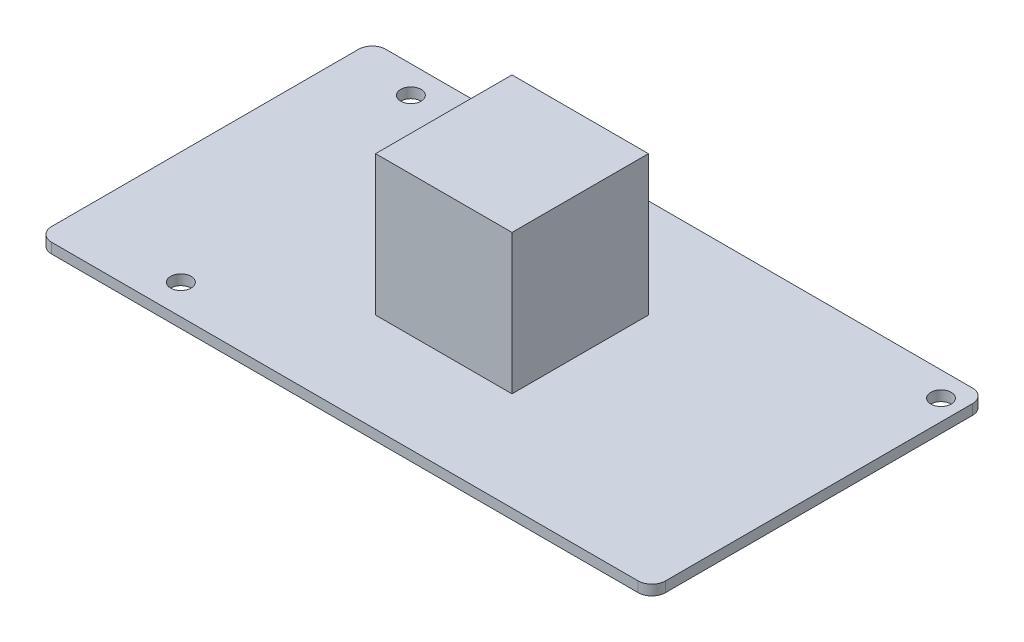
ISO-10303-21;
HEADER;
FILE_DESCRIPTION(('STEP AP214'),'2;1');
FILE_NAME('part.step','',(''),(''),'','','');
FILE_SCHEMA(('AUTOMOTIVE_DESIGN { 1 0 10303 214 1 1 1 1 }'));
ENDSEC;
DATA;
#1=APPLICATION_CONTEXT('core data for automotive mechanical design processes');
#2=APPLICATION_PROTOCOL_DEFINITION('international standard','automotive_design',2000,#1);
#3=PRODUCT_CONTEXT('',#1,'mechanical');
#4=PRODUCT('Part','Part','',(#3));
#5=PRODUCT_RELATED_PRODUCT_CATEGORY('part','',(#4));
#6=PRODUCT_DEFINITION_FORMATION('','',#4);
#7=PRODUCT_DEFINITION_CONTEXT('part definition',#1,'design');
#8=PRODUCT_DEFINITION('design','',#6,#7);
#9=PRODUCT_DEFINITION_SHAPE('','',#8);
#10=(LENGTH_UNIT() NAMED_UNIT(*) SI_UNIT(.MILLI.,.METRE.));
#11=(NAMED_UNIT(*) PLANE_ANGLE_UNIT() SI_UNIT($,.RADIAN.));
#12=(NAMED_UNIT(*) SI_UNIT($,.STERADIAN.) SOLID_ANGLE_UNIT());
#13=UNCERTAINTY_MEASURE_WITH_UNIT(LENGTH_MEASURE(1.E-05),#10,'distance_accuracy_value','');
#14=(GEOMETRIC_REPRESENTATION_CONTEXT(3) GLOBAL_UNCERTAINTY_ASSIGNED_CONTEXT((#13)) GLOBAL_UNIT_ASSIGNED_CONTEXT((#10,
#11,#12)) REPRESENTATION_CONTEXT('',''));
#15=CARTESIAN_POINT('',(0.,0.,0.));
#16=DIRECTION('',(0.,0.,1.));
#17=DIRECTION('',(1.,0.,0.));
#18=AXIS2_PLACEMENT_3D('',#15,#16,#17);
#19=CARTESIAN_POINT('',(0.,0.,0.));
#20=DIRECTION('',(0.,-1.,0.));
#21=DIRECTION('',(0.,0.,-1.));
#22=AXIS2_PLACEMENT_3D('',#19,#20,#21);
#23=PLANE('',#22);
#24=CARTESIAN_POINT('',(-35.325,0.,-20.5));
#25=DIRECTION('',(0.,1.,0.));
#26=DIRECTION('',(0.,0.,1.));
#27=AXIS2_PLACEMENT_3D('',#24,#25,#26);
#28=CIRCLE('',#27,1.5);
#29=CARTESIAN_POINT('',(-35.325,0.,-19.));
#30=VERTEX_POINT('',#29);
#31=EDGE_CURVE('E177',#30,#30,#28,.T.);
#32=ORIENTED_EDGE('',*,*,#31,.T.);
#33=EDGE_LOOP('',(#32));
#34=FACE_BOUND('',#33,.T.);
#35=CARTESIAN_POINT('',(42.,0.,-20.9));
#36=DIRECTION('',(0.,1.,0.));
#37=DIRECTION('',(0.,0.,1.));
#38=AXIS2_PLACEMENT_3D('',#35,#36,#37);
#39=CIRCLE('',#38,1.5);
#40=CARTESIAN_POINT('',(42.,0.,-19.4));
#41=VERTEX_POINT('',#40);
#42=EDGE_CURVE('E185',#41,#41,#39,.T.);
#43=ORIENTED_EDGE('',*,*,#42,.T.);
#44=EDGE_LOOP('',(#43));
#45=FACE_BOUND('',#44,.T.);
#46=DIRECTION('',(0.,0.,1.));
#47=VECTOR('',#46,1.);
#48=CARTESIAN_POINT('',(-45.,0.,24.5));
#49=LINE('',#48,#47);
#50=CARTESIAN_POINT('',(-45.,0.,-22.5));
#51=VERTEX_POINT('',#50);
#52=CARTESIAN_POINT('',(-45.,0.,22.5));
#53=VERTEX_POINT('',#52);
#54=EDGE_CURVE('E222',#51,#53,#49,.T.);
#55=ORIENTED_EDGE('',*,*,#54,.F.);
#56=CARTESIAN_POINT('',(-43.,0.,-22.5));
#57=DIRECTION('',(0.,-1.,0.));
#58=DIRECTION('',(0.,0.,-1.));
#59=AXIS2_PLACEMENT_3D('',#56,#57,#58);
#60=CIRCLE('',#59,2.);
#61=CARTESIAN_POINT('',(-43.,0.,-24.5));
#62=VERTEX_POINT('',#61);
#63=EDGE_CURVE('E243',#51,#62,#60,.T.);
#64=ORIENTED_EDGE('',*,*,#63,.T.);
#65=DIRECTION('',(-1.,0.,0.));
#66=VECTOR('',#65,1.);
#67=CARTESIAN_POINT('',(-45.,0.,-24.5));
#68=LINE('',#67,#66);
#69=CARTESIAN_POINT('',(43.,0.,-24.5));
#70=VERTEX_POINT('',#69);
#71=EDGE_CURVE('E218',#70,#62,#68,.T.);
#72=ORIENTED_EDGE('',*,*,#71,.F.);
#73=CARTESIAN_POINT('',(43.,0.,-22.5));
#74=DIRECTION('',(0.,-1.,0.));
#75=DIRECTION('',(0.,0.,-1.));
#76=AXIS2_PLACEMENT_3D('',#73,#74,#75);
#77=CIRCLE('',#76,2.);
#78=CARTESIAN_POINT('',(45.,0.,-22.5));
#79=VERTEX_POINT('',#78);
#80=EDGE_CURVE('E240',#70,#79,#77,.T.);
#81=ORIENTED_EDGE('',*,*,#80,.T.);
#82=DIRECTION('',(0.,0.,-1.));
#83=VECTOR('',#82,1.);
#84=CARTESIAN_POINT('',(45.,0.,24.5));
#85=LINE('',#84,#83);
#86=CARTESIAN_POINT('',(45.,0.,22.5));
#87=VERTEX_POINT('',#86);
#88=EDGE_CURVE('E197',#87,#79,#85,.T.);
#89=ORIENTED_EDGE('',*,*,#88,.F.);
#90=CARTESIAN_POINT('',(43.,0.,22.5));
#91=DIRECTION('',(0.,-1.,0.));
#92=DIRECTION('',(0.,0.,-1.));
#93=AXIS2_PLACEMENT_3D('',#90,#91,#92);
#94=CIRCLE('',#93,2.);
#95=CARTESIAN_POINT('',(43.,0.,24.5));
#96=VERTEX_POINT('',#95);
#97=EDGE_CURVE('E237',#87,#96,#94,.T.);
#98=ORIENTED_EDGE('',*,*,#97,.T.);
#99=DIRECTION('',(1.,0.,0.));
#100=VECTOR('',#99,1.);
#101=CARTESIAN_POINT('',(-45.,0.,24.5));
#102=LINE('',#101,#100);
#103=CARTESIAN_POINT('',(-43.,0.,24.5));
#104=VERTEX_POINT('',#103);
#105=EDGE_CURVE('E203',#104,#96,#102,.T.);
#106=ORIENTED_EDGE('',*,*,#105,.F.);
#107=CARTESIAN_POINT('',(-43.,0.,22.5));
#108=DIRECTION('',(0.,-1.,0.));
#109=DIRECTION('',(0.,0.,-1.));
#110=AXIS2_PLACEMENT_3D('',#107,#108,#109);
#111=CIRCLE('',#110,2.);
#112=EDGE_CURVE('E234',#104,#53,#111,.T.);
#113=ORIENTED_EDGE('',*,*,#112,.T.);
#114=EDGE_LOOP('',(#55,#64,#72,#81,#89,#98,#106,#113));
#115=FACE_BOUND('',#114,.T.);
#116=CARTESIAN_POINT('',(-28.45,0.,20.1));
#117=DIRECTION('',(0.,1.,0.));
#118=DIRECTION('',(0.,0.,1.));
#119=AXIS2_PLACEMENT_3D('',#116,#117,#118);
#120=CIRCLE('',#119,1.5);
#121=CARTESIAN_POINT('',(-28.45,0.,21.6));
#122=VERTEX_POINT('',#121);
#123=EDGE_CURVE('E193',#122,#122,#120,.T.);
#124=ORIENTED_EDGE('',*,*,#123,.T.);
#125=EDGE_LOOP('',(#124));
#126=FACE_BOUND('',#125,.T.);
#127=ADVANCED_FACE('F43',(#34,#45,#115,#126),#23,.T.);
#128=CARTESIAN_POINT('',(45.,1.5,24.5));
#129=DIRECTION('',(-1.,0.,0.));
#130=DIRECTION('',(0.,0.,1.));
#131=AXIS2_PLACEMENT_3D('',#128,#129,#130);
#132=PLANE('',#131);
#133=ORIENTED_EDGE('',*,*,#88,.T.);
#134=DIRECTION('',(0.,-1.,0.));
#135=VECTOR('',#134,1.);
#136=CARTESIAN_POINT('',(45.,1.5,-22.5));
#137=LINE('',#136,#135);
#138=CARTESIAN_POINT('',(45.,1.5,-22.5));
#139=VERTEX_POINT('',#138);
#140=EDGE_CURVE('E269',#79,#139,#137,.F.);
#141=ORIENTED_EDGE('',*,*,#140,.T.);
#142=DIRECTION('',(0.,0.,-1.));
#143=VECTOR('',#142,1.);
#144=CARTESIAN_POINT('',(45.,1.5,24.5));
#145=LINE('',#144,#143);
#146=CARTESIAN_POINT('',(45.,1.5,22.5));
#147=VERTEX_POINT('',#146);
#148=EDGE_CURVE('E198',#147,#139,#145,.T.);
#149=ORIENTED_EDGE('',*,*,#148,.F.);
#150=DIRECTION('',(0.,-1.,0.));
#151=VECTOR('',#150,1.);
#152=CARTESIAN_POINT('',(45.,1.5,22.5));
#153=LINE('',#152,#151);
#154=EDGE_CURVE('E265',#147,#87,#153,.T.);
#155=ORIENTED_EDGE('',*,*,#154,.T.);
#156=EDGE_LOOP('',(#133,#141,#149,#155));
#157=FACE_BOUND('',#156,.T.);
#158=ADVANCED_FACE('F301',(#157),#132,.F.);
#159=CARTESIAN_POINT('',(-45.,1.5,-24.5));
#160=DIRECTION('',(0.,0.,1.));
#161=DIRECTION('',(1.,0.,0.));
#162=AXIS2_PLACEMENT_3D('',#159,#160,#161);
#163=PLANE('',#162);
#164=ORIENTED_EDGE('',*,*,#71,.T.);
#165=DIRECTION('',(0.,-1.,0.));
#166=VECTOR('',#165,1.);
#167=CARTESIAN_POINT('',(-43.,1.5,-24.5));
#168=LINE('',#167,#166);
#169=CARTESIAN_POINT('',(-43.,1.5,-24.5));
#170=VERTEX_POINT('',#169);
#171=EDGE_CURVE('E250',#62,#170,#168,.F.);
#172=ORIENTED_EDGE('',*,*,#171,.T.);
#173=DIRECTION('',(-1.,0.,0.));
#174=VECTOR('',#173,1.);
#175=CARTESIAN_POINT('',(-45.,1.5,-24.5));
#176=LINE('',#175,#174);
#177=CARTESIAN_POINT('',(43.,1.5,-24.5));
#178=VERTEX_POINT('',#177);
#179=EDGE_CURVE('E202',#178,#170,#176,.T.);
#180=ORIENTED_EDGE('',*,*,#179,.F.);
#181=DIRECTION('',(0.,-1.,0.));
#182=VECTOR('',#181,1.);
#183=CARTESIAN_POINT('',(43.,1.5,-24.5));
#184=LINE('',#183,#182);
#185=EDGE_CURVE('E246',#178,#70,#184,.T.);
#186=ORIENTED_EDGE('',*,*,#185,.T.);
#187=EDGE_LOOP('',(#164,#172,#180,#186));
#188=FACE_BOUND('',#187,.T.);
#189=ADVANCED_FACE('F307',(#188),#163,.F.);
#190=CARTESIAN_POINT('',(-45.,1.5,24.5));
#191=DIRECTION('',(1.,0.,0.));
#192=DIRECTION('',(0.,0.,-1.));
#193=AXIS2_PLACEMENT_3D('',#190,#191,#192);
#194=PLANE('',#193);
#195=DIRECTION('',(0.,0.,1.));
#196=VECTOR('',#195,1.);
#197=CARTESIAN_POINT('',(-45.,1.5,24.5));
#198=LINE('',#197,#196);
#199=CARTESIAN_POINT('',(-45.,1.5,-22.5));
#200=VERTEX_POINT('',#199);
#201=CARTESIAN_POINT('',(-45.,1.5,22.5));
#202=VERTEX_POINT('',#201);
#203=EDGE_CURVE('E207',#200,#202,#198,.T.);
#204=ORIENTED_EDGE('',*,*,#203,.F.);
#205=DIRECTION('',(0.,-1.,0.));
#206=VECTOR('',#205,1.);
#207=CARTESIAN_POINT('',(-45.,1.5,-22.5));
#208=LINE('',#207,#206);
#209=EDGE_CURVE('E230',#200,#51,#208,.T.);
#210=ORIENTED_EDGE('',*,*,#209,.T.);
#211=ORIENTED_EDGE('',*,*,#54,.T.);
#212=DIRECTION('',(0.,-1.,0.));
#213=VECTOR('',#212,1.);
#214=CARTESIAN_POINT('',(-45.,1.5,22.5));
#215=LINE('',#214,#213);
#216=EDGE_CURVE('E214',#53,#202,#215,.F.);
#217=ORIENTED_EDGE('',*,*,#216,.T.);
#218=EDGE_LOOP('',(#204,#210,#211,#217));
#219=FACE_BOUND('',#218,.T.);
#220=ADVANCED_FACE('F317',(#219),#194,.F.);
#221=CARTESIAN_POINT('',(-45.,1.5,24.5));
#222=DIRECTION('',(0.,0.,-1.));
#223=DIRECTION('',(-1.,0.,0.));
#224=AXIS2_PLACEMENT_3D('',#221,#222,#223);
#225=PLANE('',#224);
#226=ORIENTED_EDGE('',*,*,#105,.T.);
#227=DIRECTION('',(0.,-1.,0.));
#228=VECTOR('',#227,1.);
#229=CARTESIAN_POINT('',(43.,1.5,24.5));
#230=LINE('',#229,#228);
#231=CARTESIAN_POINT('',(43.,1.5,24.5));
#232=VERTEX_POINT('',#231);
#233=EDGE_CURVE('E67',#96,#232,#230,.F.);
#234=ORIENTED_EDGE('',*,*,#233,.T.);
#235=DIRECTION('',(1.,0.,0.));
#236=VECTOR('',#235,1.);
#237=CARTESIAN_POINT('',(-45.,1.5,24.5));
#238=LINE('',#237,#236);
#239=CARTESIAN_POINT('',(-43.,1.5,24.5));
#240=VERTEX_POINT('',#239);
#241=EDGE_CURVE('E211',#240,#232,#238,.T.);
#242=ORIENTED_EDGE('',*,*,#241,.F.);
#243=DIRECTION('',(0.,-1.,0.));
#244=VECTOR('',#243,1.);
#245=CARTESIAN_POINT('',(-43.,1.5,24.5));
#246=LINE('',#245,#244);
#247=EDGE_CURVE('E272',#240,#104,#246,.T.);
#248=ORIENTED_EDGE('',*,*,#247,.T.);
#249=EDGE_LOOP('',(#226,#234,#242,#248));
#250=FACE_BOUND('',#249,.T.);
#251=ADVANCED_FACE('F314',(#250),#225,.F.);
#252=CARTESIAN_POINT('',(0.,1.5,0.));
#253=DIRECTION('',(0.,-1.,0.));
#254=DIRECTION('',(0.,0.,-1.));
#255=AXIS2_PLACEMENT_3D('',#252,#253,#254);
#256=PLANE('',#255);
#257=DIRECTION('',(-1.,0.,0.));
#258=VECTOR('',#257,1.);
#259=CARTESIAN_POINT('',(0.,1.5,10.));
#260=LINE('',#259,#258);
#261=CARTESIAN_POINT('',(10.,1.5,10.));
#262=VERTEX_POINT('',#261);
#263=CARTESIAN_POINT('',(-10.,1.5,10.));
#264=VERTEX_POINT('',#263);
#265=EDGE_CURVE('E52',#262,#264,#260,.T.);
#266=ORIENTED_EDGE('',*,*,#265,.T.);
#267=DIRECTION('',(0.,0.,-1.));
#268=VECTOR('',#267,1.);
#269=CARTESIAN_POINT('',(-10.,1.5,0.));
#270=LINE('',#269,#268);
#271=CARTESIAN_POINT('',(-10.,1.5,-10.));
#272=VERTEX_POINT('',#271);
#273=EDGE_CURVE('E11',#264,#272,#270,.T.);
#274=ORIENTED_EDGE('',*,*,#273,.T.);
#275=DIRECTION('',(1.,0.,0.));
#276=VECTOR('',#275,1.);
#277=CARTESIAN_POINT('',(0.,1.5,-10.));
#278=LINE('',#277,#276);
#279=CARTESIAN_POINT('',(10.,1.5,-10.));
#280=VERTEX_POINT('',#279);
#281=EDGE_CURVE('E138',#272,#280,#278,.T.);
#282=ORIENTED_EDGE('',*,*,#281,.T.);
#283=DIRECTION('',(0.,0.,1.));
#284=VECTOR('',#283,1.);
#285=CARTESIAN_POINT('',(10.,1.5,0.));
#286=LINE('',#285,#284);
#287=EDGE_CURVE('E280',#280,#262,#286,.T.);
#288=ORIENTED_EDGE('',*,*,#287,.T.);
#289=EDGE_LOOP('',(#266,#274,#282,#288));
#290=FACE_BOUND('',#289,.T.);
#291=CARTESIAN_POINT('',(-35.325,1.5,-20.5));
#292=DIRECTION('',(0.,1.,0.));
#293=DIRECTION('',(0.,0.,1.));
#294=AXIS2_PLACEMENT_3D('',#291,#292,#293);
#295=CIRCLE('',#294,1.49999999999999);
#296=CARTESIAN_POINT('',(-35.325,1.5,-19.));
#297=VERTEX_POINT('',#296);
#298=EDGE_CURVE('E167',#297,#297,#295,.T.);
#299=ORIENTED_EDGE('',*,*,#298,.F.);
#300=EDGE_LOOP('',(#299));
#301=FACE_BOUND('',#300,.T.);
#302=CARTESIAN_POINT('',(42.,1.5,-20.9));
#303=DIRECTION('',(0.,1.,0.));
#304=DIRECTION('',(0.,0.,1.));
#305=AXIS2_PLACEMENT_3D('',#302,#303,#304);
#306=CIRCLE('',#305,1.49999999999999);
#307=CARTESIAN_POINT('',(42.,1.5,-19.4));
#308=VERTEX_POINT('',#307);
#309=EDGE_CURVE('E181',#308,#308,#306,.T.);
#310=ORIENTED_EDGE('',*,*,#309,.F.);
#311=EDGE_LOOP('',(#310));
#312=FACE_BOUND('',#311,.T.);
#313=CARTESIAN_POINT('',(-28.45,1.5,20.1));
#314=DIRECTION('',(0.,1.,0.));
#315=DIRECTION('',(0.,0.,1.));
#316=AXIS2_PLACEMENT_3D('',#313,#314,#315);
#317=CIRCLE('',#316,1.49999999999999);
#318=CARTESIAN_POINT('',(-28.45,1.5,21.6));
#319=VERTEX_POINT('',#318);
#320=EDGE_CURVE('E189',#319,#319,#317,.T.);
#321=ORIENTED_EDGE('',*,*,#320,.F.);
#322=EDGE_LOOP('',(#321));
#323=FACE_BOUND('',#322,.T.);
#324=ORIENTED_EDGE('',*,*,#179,.T.);
#325=CARTESIAN_POINT('',(-43.,1.5,-22.5));
#326=DIRECTION('',(0.,-1.,0.));
#327=DIRECTION('',(0.,0.,-1.));
#328=AXIS2_PLACEMENT_3D('',#325,#326,#327);
#329=CIRCLE('',#328,2.);
#330=EDGE_CURVE('E262',#170,#200,#329,.F.);
#331=ORIENTED_EDGE('',*,*,#330,.T.);
#332=ORIENTED_EDGE('',*,*,#203,.T.);
#333=CARTESIAN_POINT('',(-43.,1.5,22.5));
#334=DIRECTION('',(0.,-1.,0.));
#335=DIRECTION('',(0.,0.,-1.));
#336=AXIS2_PLACEMENT_3D('',#333,#334,#335);
#337=CIRCLE('',#336,2.);
#338=EDGE_CURVE('E253',#202,#240,#337,.F.);
#339=ORIENTED_EDGE('',*,*,#338,.T.);
#340=ORIENTED_EDGE('',*,*,#241,.T.);
#341=CARTESIAN_POINT('',(43.,1.5,22.5));
#342=DIRECTION('',(0.,-1.,0.));
#343=DIRECTION('',(0.,0.,-1.));
#344=AXIS2_PLACEMENT_3D('',#341,#342,#343);
#345=CIRCLE('',#344,2.);
#346=EDGE_CURVE('E256',#232,#147,#345,.F.);
#347=ORIENTED_EDGE('',*,*,#346,.T.);
#348=ORIENTED_EDGE('',*,*,#148,.T.);
#349=CARTESIAN_POINT('',(43.,1.5,-22.5));
#350=DIRECTION('',(0.,-1.,0.));
#351=DIRECTION('',(0.,0.,-1.));
#352=AXIS2_PLACEMENT_3D('',#349,#350,#351);
#353=CIRCLE('',#352,2.);
#354=EDGE_CURVE('E259',#139,#178,#353,.F.);
#355=ORIENTED_EDGE('',*,*,#354,.T.);
#356=EDGE_LOOP('',(#324,#331,#332,#339,#340,#347,#348,#355));
#357=FACE_BOUND('',#356,.T.);
#358=ADVANCED_FACE('F286',(#290,#301,#312,#323,#357),#256,.F.);
#359=CARTESIAN_POINT('',(-43.,1.5,-22.5));
#360=DIRECTION('',(0.,-1.,0.));
#361=DIRECTION('',(0.,0.,-1.));
#362=AXIS2_PLACEMENT_3D('',#359,#360,#361);
#363=CYLINDRICAL_SURFACE('',#362,2.);
#364=ORIENTED_EDGE('',*,*,#330,.F.);
#365=ORIENTED_EDGE('',*,*,#171,.F.);
#366=ORIENTED_EDGE('',*,*,#63,.F.);
#367=ORIENTED_EDGE('',*,*,#209,.F.);
#368=EDGE_LOOP('',(#364,#365,#366,#367));
#369=FACE_BOUND('',#368,.T.);
#370=ADVANCED_FACE('F324',(#369),#363,.T.);
#371=CARTESIAN_POINT('',(43.,1.5,-22.5));
#372=DIRECTION('',(0.,-1.,0.));
#373=DIRECTION('',(0.,0.,-1.));
#374=AXIS2_PLACEMENT_3D('',#371,#372,#373);
#375=CYLINDRICAL_SURFACE('',#374,2.);
#376=ORIENTED_EDGE('',*,*,#354,.F.);
#377=ORIENTED_EDGE('',*,*,#140,.F.);
#378=ORIENTED_EDGE('',*,*,#80,.F.);
#379=ORIENTED_EDGE('',*,*,#185,.F.);
#380=EDGE_LOOP('',(#376,#377,#378,#379));
#381=FACE_BOUND('',#380,.T.);
#382=ADVANCED_FACE('F327',(#381),#375,.T.);
#383=CARTESIAN_POINT('',(43.,1.5,22.5));
#384=DIRECTION('',(0.,-1.,0.));
#385=DIRECTION('',(0.,0.,-1.));
#386=AXIS2_PLACEMENT_3D('',#383,#384,#385);
#387=CYLINDRICAL_SURFACE('',#386,2.);
#388=ORIENTED_EDGE('',*,*,#346,.F.);
#389=ORIENTED_EDGE('',*,*,#233,.F.);
#390=ORIENTED_EDGE('',*,*,#97,.F.);
#391=ORIENTED_EDGE('',*,*,#154,.F.);
#392=EDGE_LOOP('',(#388,#389,#390,#391));
#393=FACE_BOUND('',#392,.T.);
#394=ADVANCED_FACE('F330',(#393),#387,.T.);
#395=CARTESIAN_POINT('',(-43.,1.5,22.5));
#396=DIRECTION('',(0.,-1.,0.));
#397=DIRECTION('',(0.,0.,-1.));
#398=AXIS2_PLACEMENT_3D('',#395,#396,#397);
#399=CYLINDRICAL_SURFACE('',#398,2.);
#400=ORIENTED_EDGE('',*,*,#338,.F.);
#401=ORIENTED_EDGE('',*,*,#216,.F.);
#402=ORIENTED_EDGE('',*,*,#112,.F.);
#403=ORIENTED_EDGE('',*,*,#247,.F.);
#404=EDGE_LOOP('',(#400,#401,#402,#403));
#405=FACE_BOUND('',#404,.T.);
#406=ADVANCED_FACE('F45',(#405),#399,.T.);
#407=CARTESIAN_POINT('',(-28.45,1.5,20.1));
#408=DIRECTION('',(0.,1.,0.));
#409=DIRECTION('',(0.,0.,1.));
#410=AXIS2_PLACEMENT_3D('',#407,#408,#409);
#411=CYLINDRICAL_SURFACE('',#410,1.49999999999999);
#412=ORIENTED_EDGE('',*,*,#123,.F.);
#413=EDGE_LOOP('',(#412));
#414=FACE_BOUND('',#413,.T.);
#415=ORIENTED_EDGE('',*,*,#320,.T.);
#416=EDGE_LOOP('',(#415));
#417=FACE_BOUND('',#416,.T.);
#418=ADVANCED_FACE('F337',(#414,#417),#411,.F.);
#419=CARTESIAN_POINT('',(42.,1.5,-20.9));
#420=DIRECTION('',(0.,1.,0.));
#421=DIRECTION('',(0.,0.,1.));
#422=AXIS2_PLACEMENT_3D('',#419,#420,#421);
#423=CYLINDRICAL_SURFACE('',#422,1.49999999999999);
#424=ORIENTED_EDGE('',*,*,#42,.F.);
#425=EDGE_LOOP('',(#424));
#426=FACE_BOUND('',#425,.T.);
#427=ORIENTED_EDGE('',*,*,#309,.T.);
#428=EDGE_LOOP('',(#427));
#429=FACE_BOUND('',#428,.T.);
#430=ADVANCED_FACE('F364',(#426,#429),#423,.F.);
#431=CARTESIAN_POINT('',(-35.325,1.5,-20.5));
#432=DIRECTION('',(0.,1.,0.));
#433=DIRECTION('',(0.,0.,1.));
#434=AXIS2_PLACEMENT_3D('',#431,#432,#433);
#435=CYLINDRICAL_SURFACE('',#434,1.49999999999999);
#436=ORIENTED_EDGE('',*,*,#31,.F.);
#437=EDGE_LOOP('',(#436));
#438=FACE_BOUND('',#437,.T.);
#439=ORIENTED_EDGE('',*,*,#298,.T.);
#440=EDGE_LOOP('',(#439));
#441=FACE_BOUND('',#440,.T.);
#442=ADVANCED_FACE('F411',(#438,#441),#435,.F.);
#443=CARTESIAN_POINT('',(-10.,22.,-10.));
#444=DIRECTION('',(-1.,0.,0.));
#445=DIRECTION('',(0.,0.,1.));
#446=AXIS2_PLACEMENT_3D('',#443,#444,#445);
#447=PLANE('',#446);
#448=ORIENTED_EDGE('',*,*,#273,.F.);
#449=DIRECTION('',(0.,-1.,0.));
#450=VECTOR('',#449,1.);
#451=CARTESIAN_POINT('',(-10.,22.,10.));
#452=LINE('',#451,#450);
#453=CARTESIAN_POINT('',(-10.,22.,10.));
#454=VERTEX_POINT('',#453);
#455=EDGE_CURVE('E157',#454,#264,#452,.T.);
#456=ORIENTED_EDGE('',*,*,#455,.F.);
#457=DIRECTION('',(0.,0.,-1.));
#458=VECTOR('',#457,1.);
#459=CARTESIAN_POINT('',(-10.,22.,-10.));
#460=LINE('',#459,#458);
#461=CARTESIAN_POINT('',(-10.,22.,-10.));
#462=VERTEX_POINT('',#461);
#463=EDGE_CURVE('E149',#454,#462,#460,.T.);
#464=ORIENTED_EDGE('',*,*,#463,.T.);
#465=DIRECTION('',(0.,-1.,0.));
#466=VECTOR('',#465,1.);
#467=CARTESIAN_POINT('',(-10.,22.,-10.));
#468=LINE('',#467,#466);
#469=EDGE_CURVE('E133',#462,#272,#468,.T.);
#470=ORIENTED_EDGE('',*,*,#469,.T.);
#471=EDGE_LOOP('',(#448,#456,#464,#470));
#472=FACE_BOUND('',#471,.T.);
#473=ADVANCED_FACE('F155',(#472),#447,.T.);
#474=CARTESIAN_POINT('',(10.,22.,10.));
#475=DIRECTION('',(0.,0.,1.));
#476=DIRECTION('',(1.,0.,0.));
#477=AXIS2_PLACEMENT_3D('',#474,#475,#476);
#478=PLANE('',#477);
#479=ORIENTED_EDGE('',*,*,#265,.F.);
#480=DIRECTION('',(0.,-1.,0.));
#481=VECTOR('',#480,1.);
#482=CARTESIAN_POINT('',(10.,22.,10.));
#483=LINE('',#482,#481);
#484=CARTESIAN_POINT('',(10.,22.,10.));
#485=VERTEX_POINT('',#484);
#486=EDGE_CURVE('E168',#485,#262,#483,.T.);
#487=ORIENTED_EDGE('',*,*,#486,.F.);
#488=DIRECTION('',(-1.,0.,0.));
#489=VECTOR('',#488,1.);
#490=CARTESIAN_POINT('',(10.,22.,10.));
#491=LINE('',#490,#489);
#492=EDGE_CURVE('E142',#485,#454,#491,.T.);
#493=ORIENTED_EDGE('',*,*,#492,.T.);
#494=ORIENTED_EDGE('',*,*,#455,.T.);
#495=EDGE_LOOP('',(#479,#487,#493,#494));
#496=FACE_BOUND('',#495,.T.);
#497=ADVANCED_FACE('F289',(#496),#478,.T.);
#498=CARTESIAN_POINT('',(10.,22.,-10.));
#499=DIRECTION('',(1.,0.,0.));
#500=DIRECTION('',(0.,0.,-1.));
#501=AXIS2_PLACEMENT_3D('',#498,#499,#500);
#502=PLANE('',#501);
#503=ORIENTED_EDGE('',*,*,#287,.F.);
#504=DIRECTION('',(0.,-1.,0.));
#505=VECTOR('',#504,1.);
#506=CARTESIAN_POINT('',(10.,22.,-10.));
#507=LINE('',#506,#505);
#508=CARTESIAN_POINT('',(10.,22.,-10.));
#509=VERTEX_POINT('',#508);
#510=EDGE_CURVE('E59',#509,#280,#507,.T.);
#511=ORIENTED_EDGE('',*,*,#510,.F.);
#512=DIRECTION('',(0.,0.,1.));
#513=VECTOR('',#512,1.);
#514=CARTESIAN_POINT('',(10.,22.,-10.));
#515=LINE('',#514,#513);
#516=EDGE_CURVE('E152',#509,#485,#515,.T.);
#517=ORIENTED_EDGE('',*,*,#516,.T.);
#518=ORIENTED_EDGE('',*,*,#486,.T.);
#519=EDGE_LOOP('',(#503,#511,#517,#518));
#520=FACE_BOUND('',#519,.T.);
#521=ADVANCED_FACE('F291',(#520),#502,.T.);
#522=CARTESIAN_POINT('',(10.,22.,-10.));
#523=DIRECTION('',(0.,0.,-1.));
#524=DIRECTION('',(-1.,0.,0.));
#525=AXIS2_PLACEMENT_3D('',#522,#523,#524);
#526=PLANE('',#525);
#527=ORIENTED_EDGE('',*,*,#281,.F.);
#528=ORIENTED_EDGE('',*,*,#469,.F.);
#529=DIRECTION('',(1.,0.,0.));
#530=VECTOR('',#529,1.);
#531=CARTESIAN_POINT('',(10.,22.,-10.));
#532=LINE('',#531,#530);
#533=EDGE_CURVE('E136',#462,#509,#532,.T.);
#534=ORIENTED_EDGE('',*,*,#533,.T.);
#535=ORIENTED_EDGE('',*,*,#510,.T.);
#536=EDGE_LOOP('',(#527,#528,#534,#535));
#537=FACE_BOUND('',#536,.T.);
#538=ADVANCED_FACE('F135',(#537),#526,.T.);
#539=CARTESIAN_POINT('',(0.,22.,0.));
#540=DIRECTION('',(0.,-1.,0.));
#541=DIRECTION('',(0.,0.,-1.));
#542=AXIS2_PLACEMENT_3D('',#539,#540,#541);
#543=PLANE('',#542);
#544=ORIENTED_EDGE('',*,*,#463,.F.);
#545=ORIENTED_EDGE('',*,*,#492,.F.);
#546=ORIENTED_EDGE('',*,*,#516,.F.);
#547=ORIENTED_EDGE('',*,*,#533,.F.);
#548=EDGE_LOOP('',(#544,#545,#546,#547));
#549=FACE_BOUND('',#548,.T.);
#550=ADVANCED_FACE('F147',(#549),#543,.F.);
#551=CLOSED_SHELL('',(#127,#158,#189,#220,#251,#358,#370,#382,#394,#406,#418,#430,#442,#473,
#497,#521,#538,#550));
#552=MANIFOLD_SOLID_BREP('B2',#551);
#553=ADVANCED_BREP_SHAPE_REPRESENTATION('',(#18,#552),#14);
#554=SHAPE_DEFINITION_REPRESENTATION(#9,#553);
ENDSEC;
END-ISO-10303-21;
